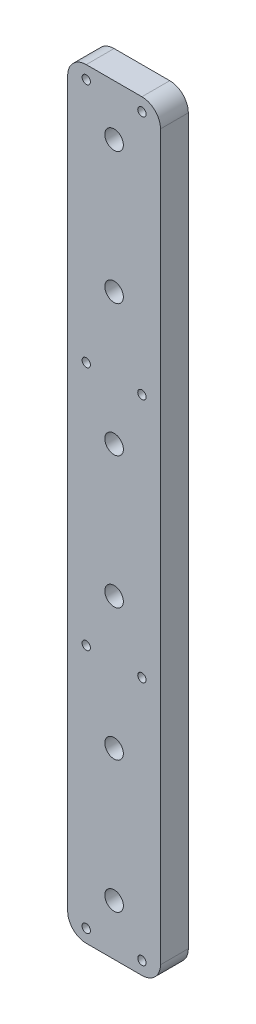
ISO-10303-21;
HEADER;
FILE_DESCRIPTION(('STEP AP214'),'2;1');
FILE_NAME('part.step','',(''),(''),'','','');
FILE_SCHEMA(('AUTOMOTIVE_DESIGN { 1 0 10303 214 1 1 1 1 }'));
ENDSEC;
DATA;
#1=APPLICATION_CONTEXT('core data for automotive mechanical design processes');
#2=APPLICATION_PROTOCOL_DEFINITION('international standard','automotive_design',2000,#1);
#3=PRODUCT_CONTEXT('',#1,'mechanical');
#4=PRODUCT('Part','Part','',(#3));
#5=PRODUCT_RELATED_PRODUCT_CATEGORY('part','',(#4));
#6=PRODUCT_DEFINITION_FORMATION('','',#4);
#7=PRODUCT_DEFINITION_CONTEXT('part definition',#1,'design');
#8=PRODUCT_DEFINITION('design','',#6,#7);
#9=PRODUCT_DEFINITION_SHAPE('','',#8);
#10=(LENGTH_UNIT() NAMED_UNIT(*) SI_UNIT(.MILLI.,.METRE.));
#11=(NAMED_UNIT(*) PLANE_ANGLE_UNIT() SI_UNIT($,.RADIAN.));
#12=(NAMED_UNIT(*) SI_UNIT($,.STERADIAN.) SOLID_ANGLE_UNIT());
#13=UNCERTAINTY_MEASURE_WITH_UNIT(LENGTH_MEASURE(1.E-05),#10,'distance_accuracy_value','');
#14=(GEOMETRIC_REPRESENTATION_CONTEXT(3) GLOBAL_UNCERTAINTY_ASSIGNED_CONTEXT((#13)) GLOBAL_UNIT_ASSIGNED_CONTEXT((#10,
#11,#12)) REPRESENTATION_CONTEXT('',''));
#15=CARTESIAN_POINT('',(0.,0.,0.));
#16=DIRECTION('',(0.,0.,1.));
#17=DIRECTION('',(1.,0.,0.));
#18=AXIS2_PLACEMENT_3D('',#15,#16,#17);
#19=CARTESIAN_POINT('',(0.,0.,15.));
#20=DIRECTION('',(1.,0.,0.));
#21=DIRECTION('',(0.,0.,-1.));
#22=AXIS2_PLACEMENT_3D('',#19,#20,#21);
#23=PLANE('',#22);
#24=DIRECTION('',(0.,-1.,0.));
#25=VECTOR('',#24,1.);
#26=CARTESIAN_POINT('',(0.,0.,0.));
#27=LINE('',#26,#25);
#28=CARTESIAN_POINT('',(0.,400.,0.));
#29=VERTEX_POINT('',#28);
#30=CARTESIAN_POINT('',(0.,10.,0.));
#31=VERTEX_POINT('',#30);
#32=EDGE_CURVE('E130',#29,#31,#27,.T.);
#33=ORIENTED_EDGE('',*,*,#32,.T.);
#34=DIRECTION('',(0.,0.,-1.));
#35=VECTOR('',#34,1.);
#36=CARTESIAN_POINT('',(0.,10.,15.));
#37=LINE('',#36,#35);
#38=CARTESIAN_POINT('',(0.,10.,15.));
#39=VERTEX_POINT('',#38);
#40=EDGE_CURVE('E152',#31,#39,#37,.F.);
#41=ORIENTED_EDGE('',*,*,#40,.T.);
#42=DIRECTION('',(0.,-1.,0.));
#43=VECTOR('',#42,1.);
#44=CARTESIAN_POINT('',(0.,0.,15.));
#45=LINE('',#44,#43);
#46=CARTESIAN_POINT('',(0.,400.,15.));
#47=VERTEX_POINT('',#46);
#48=EDGE_CURVE('E128',#47,#39,#45,.T.);
#49=ORIENTED_EDGE('',*,*,#48,.F.);
#50=DIRECTION('',(0.,0.,-1.));
#51=VECTOR('',#50,1.);
#52=CARTESIAN_POINT('',(0.,400.,15.));
#53=LINE('',#52,#51);
#54=EDGE_CURVE('E149',#47,#29,#53,.T.);
#55=ORIENTED_EDGE('',*,*,#54,.T.);
#56=EDGE_LOOP('',(#33,#41,#49,#55));
#57=FACE_BOUND('',#56,.T.);
#58=ADVANCED_FACE('F33',(#57),#23,.F.);
#59=CARTESIAN_POINT('',(0.,0.,15.));
#60=DIRECTION('',(0.,1.,0.));
#61=DIRECTION('',(0.,0.,1.));
#62=AXIS2_PLACEMENT_3D('',#59,#60,#61);
#63=PLANE('',#62);
#64=DIRECTION('',(1.,0.,0.));
#65=VECTOR('',#64,1.);
#66=CARTESIAN_POINT('',(0.,0.,0.));
#67=LINE('',#66,#65);
#68=CARTESIAN_POINT('',(10.,0.,0.));
#69=VERTEX_POINT('',#68);
#70=CARTESIAN_POINT('',(40.,0.,0.));
#71=VERTEX_POINT('',#70);
#72=EDGE_CURVE('E126',#69,#71,#67,.T.);
#73=ORIENTED_EDGE('',*,*,#72,.T.);
#74=DIRECTION('',(0.,0.,-1.));
#75=VECTOR('',#74,1.);
#76=CARTESIAN_POINT('',(40.,0.,15.));
#77=LINE('',#76,#75);
#78=CARTESIAN_POINT('',(40.,0.,15.));
#79=VERTEX_POINT('',#78);
#80=EDGE_CURVE('E104',#71,#79,#77,.F.);
#81=ORIENTED_EDGE('',*,*,#80,.T.);
#82=DIRECTION('',(1.,0.,0.));
#83=VECTOR('',#82,1.);
#84=CARTESIAN_POINT('',(0.,0.,15.));
#85=LINE('',#84,#83);
#86=CARTESIAN_POINT('',(10.,0.,15.));
#87=VERTEX_POINT('',#86);
#88=EDGE_CURVE('E166',#87,#79,#85,.T.);
#89=ORIENTED_EDGE('',*,*,#88,.F.);
#90=DIRECTION('',(0.,0.,-1.));
#91=VECTOR('',#90,1.);
#92=CARTESIAN_POINT('',(10.,0.,15.));
#93=LINE('',#92,#91);
#94=EDGE_CURVE('E109',#87,#69,#93,.T.);
#95=ORIENTED_EDGE('',*,*,#94,.T.);
#96=EDGE_LOOP('',(#73,#81,#89,#95));
#97=FACE_BOUND('',#96,.T.);
#98=ADVANCED_FACE('F171',(#97),#63,.F.);
#99=CARTESIAN_POINT('',(50.,0.,15.));
#100=DIRECTION('',(-1.,0.,0.));
#101=DIRECTION('',(0.,0.,1.));
#102=AXIS2_PLACEMENT_3D('',#99,#100,#101);
#103=PLANE('',#102);
#104=DIRECTION('',(0.,1.,0.));
#105=VECTOR('',#104,1.);
#106=CARTESIAN_POINT('',(50.,0.,15.));
#107=LINE('',#106,#105);
#108=CARTESIAN_POINT('',(50.,10.,15.));
#109=VERTEX_POINT('',#108);
#110=CARTESIAN_POINT('',(50.,400.,15.));
#111=VERTEX_POINT('',#110);
#112=EDGE_CURVE('E118',#109,#111,#107,.T.);
#113=ORIENTED_EDGE('',*,*,#112,.F.);
#114=DIRECTION('',(0.,0.,-1.));
#115=VECTOR('',#114,1.);
#116=CARTESIAN_POINT('',(50.,10.,15.));
#117=LINE('',#116,#115);
#118=CARTESIAN_POINT('',(50.,10.,0.));
#119=VERTEX_POINT('',#118);
#120=EDGE_CURVE('E103',#109,#119,#117,.T.);
#121=ORIENTED_EDGE('',*,*,#120,.T.);
#122=DIRECTION('',(0.,1.,0.));
#123=VECTOR('',#122,1.);
#124=CARTESIAN_POINT('',(50.,0.,0.));
#125=LINE('',#124,#123);
#126=CARTESIAN_POINT('',(50.,400.,0.));
#127=VERTEX_POINT('',#126);
#128=EDGE_CURVE('E116',#119,#127,#125,.T.);
#129=ORIENTED_EDGE('',*,*,#128,.T.);
#130=DIRECTION('',(0.,0.,-1.));
#131=VECTOR('',#130,1.);
#132=CARTESIAN_POINT('',(50.,400.,15.));
#133=LINE('',#132,#131);
#134=EDGE_CURVE('E120',#127,#111,#133,.F.);
#135=ORIENTED_EDGE('',*,*,#134,.T.);
#136=EDGE_LOOP('',(#113,#121,#129,#135));
#137=FACE_BOUND('',#136,.T.);
#138=ADVANCED_FACE('F115',(#137),#103,.F.);
#139=CARTESIAN_POINT('',(0.,410.,15.));
#140=DIRECTION('',(0.,-1.,0.));
#141=DIRECTION('',(0.,0.,-1.));
#142=AXIS2_PLACEMENT_3D('',#139,#140,#141);
#143=PLANE('',#142);
#144=DIRECTION('',(-1.,0.,0.));
#145=VECTOR('',#144,1.);
#146=CARTESIAN_POINT('',(0.,410.,15.));
#147=LINE('',#146,#145);
#148=CARTESIAN_POINT('',(40.,410.,15.));
#149=VERTEX_POINT('',#148);
#150=CARTESIAN_POINT('',(10.,410.,15.));
#151=VERTEX_POINT('',#150);
#152=EDGE_CURVE('E134',#149,#151,#147,.T.);
#153=ORIENTED_EDGE('',*,*,#152,.F.);
#154=DIRECTION('',(0.,0.,-1.));
#155=VECTOR('',#154,1.);
#156=CARTESIAN_POINT('',(40.,410.,15.));
#157=LINE('',#156,#155);
#158=CARTESIAN_POINT('',(40.,410.,0.));
#159=VERTEX_POINT('',#158);
#160=EDGE_CURVE('E11',#149,#159,#157,.T.);
#161=ORIENTED_EDGE('',*,*,#160,.T.);
#162=DIRECTION('',(-1.,0.,0.));
#163=VECTOR('',#162,1.);
#164=CARTESIAN_POINT('',(0.,410.,0.));
#165=LINE('',#164,#163);
#166=CARTESIAN_POINT('',(10.,410.,0.));
#167=VERTEX_POINT('',#166);
#168=EDGE_CURVE('E125',#159,#167,#165,.T.);
#169=ORIENTED_EDGE('',*,*,#168,.T.);
#170=DIRECTION('',(0.,0.,-1.));
#171=VECTOR('',#170,1.);
#172=CARTESIAN_POINT('',(10.,410.,15.));
#173=LINE('',#172,#171);
#174=EDGE_CURVE('E41',#167,#151,#173,.F.);
#175=ORIENTED_EDGE('',*,*,#174,.T.);
#176=EDGE_LOOP('',(#153,#161,#169,#175));
#177=FACE_BOUND('',#176,.T.);
#178=ADVANCED_FACE('F273',(#177),#143,.F.);
#179=CARTESIAN_POINT('',(0.,0.,15.));
#180=DIRECTION('',(0.,0.,-1.));
#181=DIRECTION('',(-1.,0.,0.));
#182=AXIS2_PLACEMENT_3D('',#179,#180,#181);
#183=PLANE('',#182);
#184=CARTESIAN_POINT('',(9.99999999999993,271.,15.));
#185=DIRECTION('',(0.,0.,-1.));
#186=DIRECTION('',(-1.,0.,0.));
#187=AXIS2_PLACEMENT_3D('',#184,#185,#186);
#188=CIRCLE('',#187,2.25000000000001);
#189=CARTESIAN_POINT('',(7.74999999999992,271.,15.));
#190=VERTEX_POINT('',#189);
#191=EDGE_CURVE('E182',#190,#190,#188,.T.);
#192=ORIENTED_EDGE('',*,*,#191,.T.);
#193=EDGE_LOOP('',(#192));
#194=FACE_BOUND('',#193,.T.);
#195=CARTESIAN_POINT('',(9.99999999999989,403.,15.));
#196=DIRECTION('',(0.,0.,-1.));
#197=DIRECTION('',(-1.,0.,0.));
#198=AXIS2_PLACEMENT_3D('',#195,#196,#197);
#199=CIRCLE('',#198,2.25);
#200=CARTESIAN_POINT('',(7.74999999999989,403.,15.));
#201=VERTEX_POINT('',#200);
#202=EDGE_CURVE('E185',#201,#201,#199,.T.);
#203=ORIENTED_EDGE('',*,*,#202,.T.);
#204=EDGE_LOOP('',(#203));
#205=FACE_BOUND('',#204,.T.);
#206=CARTESIAN_POINT('',(9.99999999999994,6.99999999999995,15.));
#207=DIRECTION('',(0.,0.,-1.));
#208=DIRECTION('',(-1.,0.,0.));
#209=AXIS2_PLACEMENT_3D('',#206,#207,#208);
#210=CIRCLE('',#209,2.25);
#211=CARTESIAN_POINT('',(7.74999999999994,6.99999999999995,15.));
#212=VERTEX_POINT('',#211);
#213=EDGE_CURVE('E188',#212,#212,#210,.T.);
#214=ORIENTED_EDGE('',*,*,#213,.T.);
#215=EDGE_LOOP('',(#214));
#216=FACE_BOUND('',#215,.T.);
#217=CARTESIAN_POINT('',(9.99999999999994,139.,15.));
#218=DIRECTION('',(0.,0.,-1.));
#219=DIRECTION('',(-1.,0.,0.));
#220=AXIS2_PLACEMENT_3D('',#217,#218,#219);
#221=CIRCLE('',#220,2.25000000000001);
#222=CARTESIAN_POINT('',(7.74999999999994,139.,15.));
#223=VERTEX_POINT('',#222);
#224=EDGE_CURVE('E191',#223,#223,#221,.T.);
#225=ORIENTED_EDGE('',*,*,#224,.T.);
#226=EDGE_LOOP('',(#225));
#227=FACE_BOUND('',#226,.T.);
#228=CARTESIAN_POINT('',(40.,139.,15.));
#229=DIRECTION('',(0.,0.,-1.));
#230=DIRECTION('',(-1.,0.,0.));
#231=AXIS2_PLACEMENT_3D('',#228,#229,#230);
#232=CIRCLE('',#231,2.25);
#233=CARTESIAN_POINT('',(37.75,139.,15.));
#234=VERTEX_POINT('',#233);
#235=EDGE_CURVE('E194',#234,#234,#232,.T.);
#236=ORIENTED_EDGE('',*,*,#235,.T.);
#237=EDGE_LOOP('',(#236));
#238=FACE_BOUND('',#237,.T.);
#239=CARTESIAN_POINT('',(40.,6.99999999999995,15.));
#240=DIRECTION('',(0.,0.,-1.));
#241=DIRECTION('',(-1.,0.,0.));
#242=AXIS2_PLACEMENT_3D('',#239,#240,#241);
#243=CIRCLE('',#242,2.25);
#244=CARTESIAN_POINT('',(37.75,6.99999999999995,15.));
#245=VERTEX_POINT('',#244);
#246=EDGE_CURVE('E197',#245,#245,#243,.T.);
#247=ORIENTED_EDGE('',*,*,#246,.T.);
#248=EDGE_LOOP('',(#247));
#249=FACE_BOUND('',#248,.T.);
#250=CARTESIAN_POINT('',(40.,403.,15.));
#251=DIRECTION('',(0.,0.,-1.));
#252=DIRECTION('',(-1.,0.,0.));
#253=AXIS2_PLACEMENT_3D('',#250,#251,#252);
#254=CIRCLE('',#253,2.25);
#255=CARTESIAN_POINT('',(37.75,403.,15.));
#256=VERTEX_POINT('',#255);
#257=EDGE_CURVE('E200',#256,#256,#254,.T.);
#258=ORIENTED_EDGE('',*,*,#257,.T.);
#259=EDGE_LOOP('',(#258));
#260=FACE_BOUND('',#259,.T.);
#261=CARTESIAN_POINT('',(25.,27.5,15.));
#262=DIRECTION('',(0.,0.,-1.));
#263=DIRECTION('',(-1.,0.,0.));
#264=AXIS2_PLACEMENT_3D('',#261,#262,#263);
#265=CIRCLE('',#264,5.);
#266=CARTESIAN_POINT('',(20.,27.5,15.));
#267=VERTEX_POINT('',#266);
#268=EDGE_CURVE('E203',#267,#267,#265,.T.);
#269=ORIENTED_EDGE('',*,*,#268,.T.);
#270=EDGE_LOOP('',(#269));
#271=FACE_BOUND('',#270,.T.);
#272=CARTESIAN_POINT('',(25.,382.5,15.));
#273=DIRECTION('',(0.,0.,-1.));
#274=DIRECTION('',(-1.,0.,0.));
#275=AXIS2_PLACEMENT_3D('',#272,#273,#274);
#276=CIRCLE('',#275,5.);
#277=CARTESIAN_POINT('',(20.,382.5,15.));
#278=VERTEX_POINT('',#277);
#279=EDGE_CURVE('E206',#278,#278,#276,.T.);
#280=ORIENTED_EDGE('',*,*,#279,.T.);
#281=EDGE_LOOP('',(#280));
#282=FACE_BOUND('',#281,.T.);
#283=CARTESIAN_POINT('',(25.,311.5,15.));
#284=DIRECTION('',(0.,0.,-1.));
#285=DIRECTION('',(-1.,0.,0.));
#286=AXIS2_PLACEMENT_3D('',#283,#284,#285);
#287=CIRCLE('',#286,5.);
#288=CARTESIAN_POINT('',(20.,311.5,15.));
#289=VERTEX_POINT('',#288);
#290=EDGE_CURVE('E209',#289,#289,#287,.T.);
#291=ORIENTED_EDGE('',*,*,#290,.T.);
#292=EDGE_LOOP('',(#291));
#293=FACE_BOUND('',#292,.T.);
#294=CARTESIAN_POINT('',(25.,98.5,15.));
#295=DIRECTION('',(0.,0.,-1.));
#296=DIRECTION('',(-1.,0.,0.));
#297=AXIS2_PLACEMENT_3D('',#294,#295,#296);
#298=CIRCLE('',#297,5.);
#299=CARTESIAN_POINT('',(20.,98.5,15.));
#300=VERTEX_POINT('',#299);
#301=EDGE_CURVE('E212',#300,#300,#298,.T.);
#302=ORIENTED_EDGE('',*,*,#301,.T.);
#303=EDGE_LOOP('',(#302));
#304=FACE_BOUND('',#303,.T.);
#305=CARTESIAN_POINT('',(25.,169.5,15.));
#306=DIRECTION('',(0.,0.,-1.));
#307=DIRECTION('',(-1.,0.,0.));
#308=AXIS2_PLACEMENT_3D('',#305,#306,#307);
#309=CIRCLE('',#308,5.);
#310=CARTESIAN_POINT('',(20.,169.5,15.));
#311=VERTEX_POINT('',#310);
#312=EDGE_CURVE('E215',#311,#311,#309,.T.);
#313=ORIENTED_EDGE('',*,*,#312,.T.);
#314=EDGE_LOOP('',(#313));
#315=FACE_BOUND('',#314,.T.);
#316=CARTESIAN_POINT('',(40.,271.,15.));
#317=DIRECTION('',(0.,0.,-1.));
#318=DIRECTION('',(-1.,0.,0.));
#319=AXIS2_PLACEMENT_3D('',#316,#317,#318);
#320=CIRCLE('',#319,2.25);
#321=CARTESIAN_POINT('',(37.75,271.,15.));
#322=VERTEX_POINT('',#321);
#323=EDGE_CURVE('E218',#322,#322,#320,.T.);
#324=ORIENTED_EDGE('',*,*,#323,.T.);
#325=EDGE_LOOP('',(#324));
#326=FACE_BOUND('',#325,.T.);
#327=CARTESIAN_POINT('',(25.,240.5,15.));
#328=DIRECTION('',(0.,0.,-1.));
#329=DIRECTION('',(-1.,0.,0.));
#330=AXIS2_PLACEMENT_3D('',#327,#328,#329);
#331=CIRCLE('',#330,5.);
#332=CARTESIAN_POINT('',(20.,240.5,15.));
#333=VERTEX_POINT('',#332);
#334=EDGE_CURVE('E172',#333,#333,#331,.T.);
#335=ORIENTED_EDGE('',*,*,#334,.T.);
#336=EDGE_LOOP('',(#335));
#337=FACE_BOUND('',#336,.T.);
#338=ORIENTED_EDGE('',*,*,#88,.T.);
#339=CARTESIAN_POINT('',(40.,10.,15.));
#340=DIRECTION('',(0.,0.,-1.));
#341=DIRECTION('',(-1.,0.,0.));
#342=AXIS2_PLACEMENT_3D('',#339,#340,#341);
#343=CIRCLE('',#342,10.);
#344=EDGE_CURVE('E147',#79,#109,#343,.F.);
#345=ORIENTED_EDGE('',*,*,#344,.T.);
#346=ORIENTED_EDGE('',*,*,#112,.T.);
#347=CARTESIAN_POINT('',(40.,400.,15.));
#348=DIRECTION('',(0.,0.,-1.));
#349=DIRECTION('',(-1.,0.,0.));
#350=AXIS2_PLACEMENT_3D('',#347,#348,#349);
#351=CIRCLE('',#350,10.);
#352=EDGE_CURVE('E54',#111,#149,#351,.F.);
#353=ORIENTED_EDGE('',*,*,#352,.T.);
#354=ORIENTED_EDGE('',*,*,#152,.T.);
#355=CARTESIAN_POINT('',(10.,400.,15.));
#356=DIRECTION('',(0.,0.,-1.));
#357=DIRECTION('',(-1.,0.,0.));
#358=AXIS2_PLACEMENT_3D('',#355,#356,#357);
#359=CIRCLE('',#358,10.);
#360=EDGE_CURVE('E142',#151,#47,#359,.F.);
#361=ORIENTED_EDGE('',*,*,#360,.T.);
#362=ORIENTED_EDGE('',*,*,#48,.T.);
#363=CARTESIAN_POINT('',(10.,10.,15.));
#364=DIRECTION('',(0.,0.,-1.));
#365=DIRECTION('',(-1.,0.,0.));
#366=AXIS2_PLACEMENT_3D('',#363,#364,#365);
#367=CIRCLE('',#366,10.);
#368=EDGE_CURVE('E145',#39,#87,#367,.F.);
#369=ORIENTED_EDGE('',*,*,#368,.T.);
#370=EDGE_LOOP('',(#338,#345,#346,#353,#354,#361,#362,#369));
#371=FACE_BOUND('',#370,.T.);
#372=ADVANCED_FACE('F163',(#194,#205,#216,#227,#238,#249,#260,#271,#282,#293,#304,#315,#326,
#337,#371),#183,.F.);
#373=CARTESIAN_POINT('',(0.,0.,0.));
#374=DIRECTION('',(0.,0.,-1.));
#375=DIRECTION('',(-1.,0.,0.));
#376=AXIS2_PLACEMENT_3D('',#373,#374,#375);
#377=PLANE('',#376);
#378=CARTESIAN_POINT('',(9.99999999999993,271.,0.));
#379=DIRECTION('',(0.,0.,1.));
#380=DIRECTION('',(-1.,0.,0.));
#381=AXIS2_PLACEMENT_3D('',#378,#379,#380);
#382=CIRCLE('',#381,2.25000000000001);
#383=CARTESIAN_POINT('',(7.74999999999992,271.,0.));
#384=VERTEX_POINT('',#383);
#385=EDGE_CURVE('E240',#384,#384,#382,.T.);
#386=ORIENTED_EDGE('',*,*,#385,.T.);
#387=EDGE_LOOP('',(#386));
#388=FACE_BOUND('',#387,.T.);
#389=CARTESIAN_POINT('',(9.99999999999989,403.,0.));
#390=DIRECTION('',(0.,0.,1.));
#391=DIRECTION('',(-1.,0.,0.));
#392=AXIS2_PLACEMENT_3D('',#389,#390,#391);
#393=CIRCLE('',#392,2.25);
#394=CARTESIAN_POINT('',(7.74999999999989,403.,0.));
#395=VERTEX_POINT('',#394);
#396=EDGE_CURVE('E243',#395,#395,#393,.T.);
#397=ORIENTED_EDGE('',*,*,#396,.T.);
#398=EDGE_LOOP('',(#397));
#399=FACE_BOUND('',#398,.T.);
#400=CARTESIAN_POINT('',(9.99999999999994,6.99999999999995,0.));
#401=DIRECTION('',(0.,0.,1.));
#402=DIRECTION('',(1.,0.,0.));
#403=AXIS2_PLACEMENT_3D('',#400,#401,#402);
#404=CIRCLE('',#403,2.25);
#405=CARTESIAN_POINT('',(12.2499999999999,6.99999999999995,0.));
#406=VERTEX_POINT('',#405);
#407=EDGE_CURVE('E246',#406,#406,#404,.T.);
#408=ORIENTED_EDGE('',*,*,#407,.T.);
#409=EDGE_LOOP('',(#408));
#410=FACE_BOUND('',#409,.T.);
#411=CARTESIAN_POINT('',(9.99999999999994,139.,0.));
#412=DIRECTION('',(0.,0.,1.));
#413=DIRECTION('',(1.,0.,0.));
#414=AXIS2_PLACEMENT_3D('',#411,#412,#413);
#415=CIRCLE('',#414,2.25000000000001);
#416=CARTESIAN_POINT('',(12.2499999999999,139.,0.));
#417=VERTEX_POINT('',#416);
#418=EDGE_CURVE('E249',#417,#417,#415,.T.);
#419=ORIENTED_EDGE('',*,*,#418,.T.);
#420=EDGE_LOOP('',(#419));
#421=FACE_BOUND('',#420,.T.);
#422=CARTESIAN_POINT('',(40.,139.,0.));
#423=DIRECTION('',(0.,0.,1.));
#424=DIRECTION('',(-1.,0.,0.));
#425=AXIS2_PLACEMENT_3D('',#422,#423,#424);
#426=CIRCLE('',#425,2.25);
#427=CARTESIAN_POINT('',(37.75,139.,0.));
#428=VERTEX_POINT('',#427);
#429=EDGE_CURVE('E252',#428,#428,#426,.T.);
#430=ORIENTED_EDGE('',*,*,#429,.T.);
#431=EDGE_LOOP('',(#430));
#432=FACE_BOUND('',#431,.T.);
#433=CARTESIAN_POINT('',(40.,6.99999999999995,0.));
#434=DIRECTION('',(0.,0.,1.));
#435=DIRECTION('',(-1.,0.,0.));
#436=AXIS2_PLACEMENT_3D('',#433,#434,#435);
#437=CIRCLE('',#436,2.25);
#438=CARTESIAN_POINT('',(37.75,6.99999999999995,0.));
#439=VERTEX_POINT('',#438);
#440=EDGE_CURVE('E255',#439,#439,#437,.T.);
#441=ORIENTED_EDGE('',*,*,#440,.T.);
#442=EDGE_LOOP('',(#441));
#443=FACE_BOUND('',#442,.T.);
#444=CARTESIAN_POINT('',(40.,403.,0.));
#445=DIRECTION('',(0.,0.,1.));
#446=DIRECTION('',(1.,0.,0.));
#447=AXIS2_PLACEMENT_3D('',#444,#445,#446);
#448=CIRCLE('',#447,2.25);
#449=CARTESIAN_POINT('',(42.25,403.,0.));
#450=VERTEX_POINT('',#449);
#451=EDGE_CURVE('E235',#450,#450,#448,.T.);
#452=ORIENTED_EDGE('',*,*,#451,.T.);
#453=EDGE_LOOP('',(#452));
#454=FACE_BOUND('',#453,.T.);
#455=CARTESIAN_POINT('',(25.,27.5,0.));
#456=DIRECTION('',(0.,0.,1.));
#457=DIRECTION('',(-1.,0.,0.));
#458=AXIS2_PLACEMENT_3D('',#455,#456,#457);
#459=CIRCLE('',#458,5.);
#460=CARTESIAN_POINT('',(20.,27.5,0.));
#461=VERTEX_POINT('',#460);
#462=EDGE_CURVE('E225',#461,#461,#459,.T.);
#463=ORIENTED_EDGE('',*,*,#462,.T.);
#464=EDGE_LOOP('',(#463));
#465=FACE_BOUND('',#464,.T.);
#466=CARTESIAN_POINT('',(25.,382.5,0.));
#467=DIRECTION('',(0.,0.,1.));
#468=DIRECTION('',(1.,0.,0.));
#469=AXIS2_PLACEMENT_3D('',#466,#467,#468);
#470=CIRCLE('',#469,5.);
#471=CARTESIAN_POINT('',(30.,382.5,0.));
#472=VERTEX_POINT('',#471);
#473=EDGE_CURVE('E224',#472,#472,#470,.T.);
#474=ORIENTED_EDGE('',*,*,#473,.T.);
#475=EDGE_LOOP('',(#474));
#476=FACE_BOUND('',#475,.T.);
#477=CARTESIAN_POINT('',(25.,311.5,0.));
#478=DIRECTION('',(0.,0.,1.));
#479=DIRECTION('',(1.,0.,0.));
#480=AXIS2_PLACEMENT_3D('',#477,#478,#479);
#481=CIRCLE('',#480,5.);
#482=CARTESIAN_POINT('',(30.,311.5,0.));
#483=VERTEX_POINT('',#482);
#484=EDGE_CURVE('E221',#483,#483,#481,.T.);
#485=ORIENTED_EDGE('',*,*,#484,.T.);
#486=EDGE_LOOP('',(#485));
#487=FACE_BOUND('',#486,.T.);
#488=CARTESIAN_POINT('',(25.,98.5,0.));
#489=DIRECTION('',(0.,0.,1.));
#490=DIRECTION('',(-1.,0.,0.));
#491=AXIS2_PLACEMENT_3D('',#488,#489,#490);
#492=CIRCLE('',#491,5.);
#493=CARTESIAN_POINT('',(20.,98.5,0.));
#494=VERTEX_POINT('',#493);
#495=EDGE_CURVE('E228',#494,#494,#492,.T.);
#496=ORIENTED_EDGE('',*,*,#495,.T.);
#497=EDGE_LOOP('',(#496));
#498=FACE_BOUND('',#497,.T.);
#499=CARTESIAN_POINT('',(25.,169.5,0.));
#500=DIRECTION('',(0.,0.,1.));
#501=DIRECTION('',(-1.,0.,0.));
#502=AXIS2_PLACEMENT_3D('',#499,#500,#501);
#503=CIRCLE('',#502,5.);
#504=CARTESIAN_POINT('',(20.,169.5,0.));
#505=VERTEX_POINT('',#504);
#506=EDGE_CURVE('E234',#505,#505,#503,.T.);
#507=ORIENTED_EDGE('',*,*,#506,.T.);
#508=EDGE_LOOP('',(#507));
#509=FACE_BOUND('',#508,.T.);
#510=CARTESIAN_POINT('',(40.,271.,0.));
#511=DIRECTION('',(0.,0.,1.));
#512=DIRECTION('',(1.,0.,0.));
#513=AXIS2_PLACEMENT_3D('',#510,#511,#512);
#514=CIRCLE('',#513,2.25);
#515=CARTESIAN_POINT('',(42.25,271.,0.));
#516=VERTEX_POINT('',#515);
#517=EDGE_CURVE('E231',#516,#516,#514,.T.);
#518=ORIENTED_EDGE('',*,*,#517,.T.);
#519=EDGE_LOOP('',(#518));
#520=FACE_BOUND('',#519,.T.);
#521=CARTESIAN_POINT('',(25.,240.5,0.));
#522=DIRECTION('',(0.,0.,1.));
#523=DIRECTION('',(1.,0.,0.));
#524=AXIS2_PLACEMENT_3D('',#521,#522,#523);
#525=CIRCLE('',#524,5.);
#526=CARTESIAN_POINT('',(30.,240.5,0.));
#527=VERTEX_POINT('',#526);
#528=EDGE_CURVE('E174',#527,#527,#525,.T.);
#529=ORIENTED_EDGE('',*,*,#528,.T.);
#530=EDGE_LOOP('',(#529));
#531=FACE_BOUND('',#530,.T.);
#532=ORIENTED_EDGE('',*,*,#128,.F.);
#533=CARTESIAN_POINT('',(40.,10.,0.));
#534=DIRECTION('',(0.,0.,-1.));
#535=DIRECTION('',(-1.,0.,0.));
#536=AXIS2_PLACEMENT_3D('',#533,#534,#535);
#537=CIRCLE('',#536,10.);
#538=EDGE_CURVE('E99',#119,#71,#537,.T.);
#539=ORIENTED_EDGE('',*,*,#538,.T.);
#540=ORIENTED_EDGE('',*,*,#72,.F.);
#541=CARTESIAN_POINT('',(10.,10.,0.));
#542=DIRECTION('',(0.,0.,-1.));
#543=DIRECTION('',(-1.,0.,0.));
#544=AXIS2_PLACEMENT_3D('',#541,#542,#543);
#545=CIRCLE('',#544,10.);
#546=EDGE_CURVE('E110',#69,#31,#545,.T.);
#547=ORIENTED_EDGE('',*,*,#546,.T.);
#548=ORIENTED_EDGE('',*,*,#32,.F.);
#549=CARTESIAN_POINT('',(10.,400.,0.));
#550=DIRECTION('',(0.,0.,-1.));
#551=DIRECTION('',(-1.,0.,0.));
#552=AXIS2_PLACEMENT_3D('',#549,#550,#551);
#553=CIRCLE('',#552,10.);
#554=EDGE_CURVE('E119',#29,#167,#553,.T.);
#555=ORIENTED_EDGE('',*,*,#554,.T.);
#556=ORIENTED_EDGE('',*,*,#168,.F.);
#557=CARTESIAN_POINT('',(40.,400.,0.));
#558=DIRECTION('',(0.,0.,-1.));
#559=DIRECTION('',(-1.,0.,0.));
#560=AXIS2_PLACEMENT_3D('',#557,#558,#559);
#561=CIRCLE('',#560,10.);
#562=EDGE_CURVE('E124',#159,#127,#561,.T.);
#563=ORIENTED_EDGE('',*,*,#562,.T.);
#564=EDGE_LOOP('',(#532,#539,#540,#547,#548,#555,#556,#563));
#565=FACE_BOUND('',#564,.T.);
#566=ADVANCED_FACE('F122',(#388,#399,#410,#421,#432,#443,#454,#465,#476,#487,#498,#509,#520,
#531,#565),#377,.T.);
#567=CARTESIAN_POINT('',(25.,240.5,0.));
#568=DIRECTION('',(0.,0.,1.));
#569=DIRECTION('',(1.,0.,0.));
#570=AXIS2_PLACEMENT_3D('',#567,#568,#569);
#571=CYLINDRICAL_SURFACE('',#570,5.);
#572=ORIENTED_EDGE('',*,*,#528,.F.);
#573=EDGE_LOOP('',(#572));
#574=FACE_BOUND('',#573,.T.);
#575=ORIENTED_EDGE('',*,*,#334,.F.);
#576=EDGE_LOOP('',(#575));
#577=FACE_BOUND('',#576,.T.);
#578=ADVANCED_FACE('F290',(#574,#577),#571,.F.);
#579=CARTESIAN_POINT('',(40.,271.,0.));
#580=DIRECTION('',(0.,0.,1.));
#581=DIRECTION('',(1.,0.,0.));
#582=AXIS2_PLACEMENT_3D('',#579,#580,#581);
#583=CYLINDRICAL_SURFACE('',#582,2.25);
#584=ORIENTED_EDGE('',*,*,#517,.F.);
#585=EDGE_LOOP('',(#584));
#586=FACE_BOUND('',#585,.T.);
#587=ORIENTED_EDGE('',*,*,#323,.F.);
#588=EDGE_LOOP('',(#587));
#589=FACE_BOUND('',#588,.T.);
#590=ADVANCED_FACE('F292',(#586,#589),#583,.F.);
#591=CARTESIAN_POINT('',(25.,169.5,0.));
#592=DIRECTION('',(0.,0.,1.));
#593=DIRECTION('',(1.,0.,0.));
#594=AXIS2_PLACEMENT_3D('',#591,#592,#593);
#595=CYLINDRICAL_SURFACE('',#594,5.);
#596=ORIENTED_EDGE('',*,*,#506,.F.);
#597=EDGE_LOOP('',(#596));
#598=FACE_BOUND('',#597,.T.);
#599=ORIENTED_EDGE('',*,*,#312,.F.);
#600=EDGE_LOOP('',(#599));
#601=FACE_BOUND('',#600,.T.);
#602=ADVANCED_FACE('F299',(#598,#601),#595,.F.);
#603=CARTESIAN_POINT('',(25.,98.5,0.));
#604=DIRECTION('',(0.,0.,1.));
#605=DIRECTION('',(1.,0.,0.));
#606=AXIS2_PLACEMENT_3D('',#603,#604,#605);
#607=CYLINDRICAL_SURFACE('',#606,5.);
#608=ORIENTED_EDGE('',*,*,#495,.F.);
#609=EDGE_LOOP('',(#608));
#610=FACE_BOUND('',#609,.T.);
#611=ORIENTED_EDGE('',*,*,#301,.F.);
#612=EDGE_LOOP('',(#611));
#613=FACE_BOUND('',#612,.T.);
#614=ADVANCED_FACE('F435',(#610,#613),#607,.F.);
#615=CARTESIAN_POINT('',(25.,311.5,0.));
#616=DIRECTION('',(0.,0.,1.));
#617=DIRECTION('',(1.,0.,0.));
#618=AXIS2_PLACEMENT_3D('',#615,#616,#617);
#619=CYLINDRICAL_SURFACE('',#618,5.);
#620=ORIENTED_EDGE('',*,*,#484,.F.);
#621=EDGE_LOOP('',(#620));
#622=FACE_BOUND('',#621,.T.);
#623=ORIENTED_EDGE('',*,*,#290,.F.);
#624=EDGE_LOOP('',(#623));
#625=FACE_BOUND('',#624,.T.);
#626=ADVANCED_FACE('F425',(#622,#625),#619,.F.);
#627=CARTESIAN_POINT('',(25.,382.5,0.));
#628=DIRECTION('',(0.,0.,1.));
#629=DIRECTION('',(1.,0.,0.));
#630=AXIS2_PLACEMENT_3D('',#627,#628,#629);
#631=CYLINDRICAL_SURFACE('',#630,5.);
#632=ORIENTED_EDGE('',*,*,#473,.F.);
#633=EDGE_LOOP('',(#632));
#634=FACE_BOUND('',#633,.T.);
#635=ORIENTED_EDGE('',*,*,#279,.F.);
#636=EDGE_LOOP('',(#635));
#637=FACE_BOUND('',#636,.T.);
#638=ADVANCED_FACE('F415',(#634,#637),#631,.F.);
#639=CARTESIAN_POINT('',(25.,27.5,0.));
#640=DIRECTION('',(0.,0.,1.));
#641=DIRECTION('',(1.,0.,0.));
#642=AXIS2_PLACEMENT_3D('',#639,#640,#641);
#643=CYLINDRICAL_SURFACE('',#642,5.);
#644=ORIENTED_EDGE('',*,*,#462,.F.);
#645=EDGE_LOOP('',(#644));
#646=FACE_BOUND('',#645,.T.);
#647=ORIENTED_EDGE('',*,*,#268,.F.);
#648=EDGE_LOOP('',(#647));
#649=FACE_BOUND('',#648,.T.);
#650=ADVANCED_FACE('F267',(#646,#649),#643,.F.);
#651=CARTESIAN_POINT('',(40.,403.,0.));
#652=DIRECTION('',(0.,0.,1.));
#653=DIRECTION('',(1.,0.,0.));
#654=AXIS2_PLACEMENT_3D('',#651,#652,#653);
#655=CYLINDRICAL_SURFACE('',#654,2.25);
#656=ORIENTED_EDGE('',*,*,#451,.F.);
#657=EDGE_LOOP('',(#656));
#658=FACE_BOUND('',#657,.T.);
#659=ORIENTED_EDGE('',*,*,#257,.F.);
#660=EDGE_LOOP('',(#659));
#661=FACE_BOUND('',#660,.T.);
#662=ADVANCED_FACE('F263',(#658,#661),#655,.F.);
#663=CARTESIAN_POINT('',(40.,6.99999999999995,0.));
#664=DIRECTION('',(0.,0.,1.));
#665=DIRECTION('',(1.,0.,0.));
#666=AXIS2_PLACEMENT_3D('',#663,#664,#665);
#667=CYLINDRICAL_SURFACE('',#666,2.25);
#668=ORIENTED_EDGE('',*,*,#440,.F.);
#669=EDGE_LOOP('',(#668));
#670=FACE_BOUND('',#669,.T.);
#671=ORIENTED_EDGE('',*,*,#246,.F.);
#672=EDGE_LOOP('',(#671));
#673=FACE_BOUND('',#672,.T.);
#674=ADVANCED_FACE('F266',(#670,#673),#667,.F.);
#675=CARTESIAN_POINT('',(40.,139.,0.));
#676=DIRECTION('',(0.,0.,1.));
#677=DIRECTION('',(1.,0.,0.));
#678=AXIS2_PLACEMENT_3D('',#675,#676,#677);
#679=CYLINDRICAL_SURFACE('',#678,2.25);
#680=ORIENTED_EDGE('',*,*,#429,.F.);
#681=EDGE_LOOP('',(#680));
#682=FACE_BOUND('',#681,.T.);
#683=ORIENTED_EDGE('',*,*,#235,.F.);
#684=EDGE_LOOP('',(#683));
#685=FACE_BOUND('',#684,.T.);
#686=ADVANCED_FACE('F381',(#682,#685),#679,.F.);
#687=CARTESIAN_POINT('',(9.99999999999994,139.,0.));
#688=DIRECTION('',(0.,0.,1.));
#689=DIRECTION('',(1.,0.,0.));
#690=AXIS2_PLACEMENT_3D('',#687,#688,#689);
#691=CYLINDRICAL_SURFACE('',#690,2.25000000000001);
#692=ORIENTED_EDGE('',*,*,#418,.F.);
#693=EDGE_LOOP('',(#692));
#694=FACE_BOUND('',#693,.T.);
#695=ORIENTED_EDGE('',*,*,#224,.F.);
#696=EDGE_LOOP('',(#695));
#697=FACE_BOUND('',#696,.T.);
#698=ADVANCED_FACE('F371',(#694,#697),#691,.F.);
#699=CARTESIAN_POINT('',(9.99999999999994,6.99999999999995,0.));
#700=DIRECTION('',(0.,0.,1.));
#701=DIRECTION('',(1.,0.,0.));
#702=AXIS2_PLACEMENT_3D('',#699,#700,#701);
#703=CYLINDRICAL_SURFACE('',#702,2.25);
#704=ORIENTED_EDGE('',*,*,#407,.F.);
#705=EDGE_LOOP('',(#704));
#706=FACE_BOUND('',#705,.T.);
#707=ORIENTED_EDGE('',*,*,#213,.F.);
#708=EDGE_LOOP('',(#707));
#709=FACE_BOUND('',#708,.T.);
#710=ADVANCED_FACE('F361',(#706,#709),#703,.F.);
#711=CARTESIAN_POINT('',(9.99999999999989,403.,0.));
#712=DIRECTION('',(0.,0.,1.));
#713=DIRECTION('',(1.,0.,0.));
#714=AXIS2_PLACEMENT_3D('',#711,#712,#713);
#715=CYLINDRICAL_SURFACE('',#714,2.25);
#716=ORIENTED_EDGE('',*,*,#396,.F.);
#717=EDGE_LOOP('',(#716));
#718=FACE_BOUND('',#717,.T.);
#719=ORIENTED_EDGE('',*,*,#202,.F.);
#720=EDGE_LOOP('',(#719));
#721=FACE_BOUND('',#720,.T.);
#722=ADVANCED_FACE('F350',(#718,#721),#715,.F.);
#723=CARTESIAN_POINT('',(9.99999999999993,271.,0.));
#724=DIRECTION('',(0.,0.,1.));
#725=DIRECTION('',(1.,0.,0.));
#726=AXIS2_PLACEMENT_3D('',#723,#724,#725);
#727=CYLINDRICAL_SURFACE('',#726,2.25000000000001);
#728=ORIENTED_EDGE('',*,*,#385,.F.);
#729=EDGE_LOOP('',(#728));
#730=FACE_BOUND('',#729,.T.);
#731=ORIENTED_EDGE('',*,*,#191,.F.);
#732=EDGE_LOOP('',(#731));
#733=FACE_BOUND('',#732,.T.);
#734=ADVANCED_FACE('F316',(#730,#733),#727,.F.);
#735=CARTESIAN_POINT('',(40.,10.,15.));
#736=DIRECTION('',(0.,0.,-1.));
#737=DIRECTION('',(-1.,0.,0.));
#738=AXIS2_PLACEMENT_3D('',#735,#736,#737);
#739=CYLINDRICAL_SURFACE('',#738,10.);
#740=ORIENTED_EDGE('',*,*,#344,.F.);
#741=ORIENTED_EDGE('',*,*,#80,.F.);
#742=ORIENTED_EDGE('',*,*,#538,.F.);
#743=ORIENTED_EDGE('',*,*,#120,.F.);
#744=EDGE_LOOP('',(#740,#741,#742,#743));
#745=FACE_BOUND('',#744,.T.);
#746=ADVANCED_FACE('F102',(#745),#739,.T.);
#747=CARTESIAN_POINT('',(10.,10.,15.));
#748=DIRECTION('',(0.,0.,-1.));
#749=DIRECTION('',(-1.,0.,0.));
#750=AXIS2_PLACEMENT_3D('',#747,#748,#749);
#751=CYLINDRICAL_SURFACE('',#750,10.);
#752=ORIENTED_EDGE('',*,*,#368,.F.);
#753=ORIENTED_EDGE('',*,*,#40,.F.);
#754=ORIENTED_EDGE('',*,*,#546,.F.);
#755=ORIENTED_EDGE('',*,*,#94,.F.);
#756=EDGE_LOOP('',(#752,#753,#754,#755));
#757=FACE_BOUND('',#756,.T.);
#758=ADVANCED_FACE('F169',(#757),#751,.T.);
#759=CARTESIAN_POINT('',(40.,400.,15.));
#760=DIRECTION('',(0.,0.,-1.));
#761=DIRECTION('',(-1.,0.,0.));
#762=AXIS2_PLACEMENT_3D('',#759,#760,#761);
#763=CYLINDRICAL_SURFACE('',#762,10.);
#764=ORIENTED_EDGE('',*,*,#352,.F.);
#765=ORIENTED_EDGE('',*,*,#134,.F.);
#766=ORIENTED_EDGE('',*,*,#562,.F.);
#767=ORIENTED_EDGE('',*,*,#160,.F.);
#768=EDGE_LOOP('',(#764,#765,#766,#767));
#769=FACE_BOUND('',#768,.T.);
#770=ADVANCED_FACE('F318',(#769),#763,.T.);
#771=CARTESIAN_POINT('',(10.,400.,15.));
#772=DIRECTION('',(0.,0.,-1.));
#773=DIRECTION('',(-1.,0.,0.));
#774=AXIS2_PLACEMENT_3D('',#771,#772,#773);
#775=CYLINDRICAL_SURFACE('',#774,10.);
#776=ORIENTED_EDGE('',*,*,#360,.F.);
#777=ORIENTED_EDGE('',*,*,#174,.F.);
#778=ORIENTED_EDGE('',*,*,#554,.F.);
#779=ORIENTED_EDGE('',*,*,#54,.F.);
#780=EDGE_LOOP('',(#776,#777,#778,#779));
#781=FACE_BOUND('',#780,.T.);
#782=ADVANCED_FACE('F35',(#781),#775,.T.);
#783=CLOSED_SHELL('',(#58,#98,#138,#178,#372,#566,#578,#590,#602,#614,#626,#638,#650,#662,#674,
#686,#698,#710,#722,#734,#746,#758,#770,#782));
#784=MANIFOLD_SOLID_BREP('B2',#783);
#785=ADVANCED_BREP_SHAPE_REPRESENTATION('',(#18,#784),#14);
#786=SHAPE_DEFINITION_REPRESENTATION(#9,#785);
ENDSEC;
END-ISO-10303-21;
